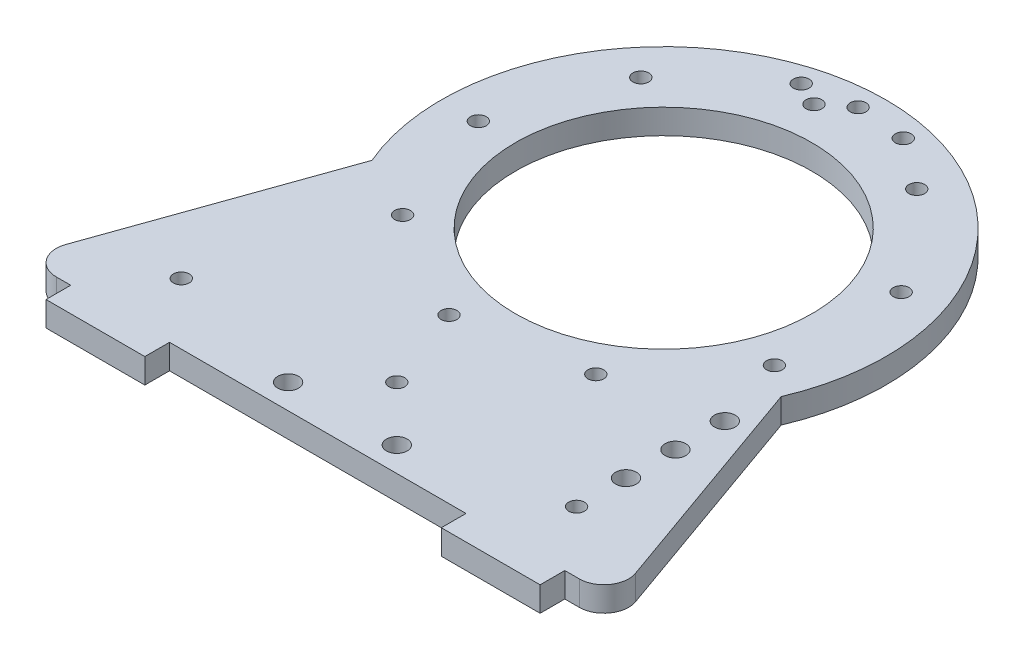
ISO-10303-21;
HEADER;
FILE_DESCRIPTION(('STEP AP214'),'2;1');
FILE_NAME('part.step','',(''),(''),'','','');
FILE_SCHEMA(('AUTOMOTIVE_DESIGN { 1 0 10303 214 1 1 1 1 }'));
ENDSEC;
DATA;
#1=APPLICATION_CONTEXT('core data for automotive mechanical design processes');
#2=APPLICATION_PROTOCOL_DEFINITION('international standard','automotive_design',2000,#1);
#3=PRODUCT_CONTEXT('',#1,'mechanical');
#4=PRODUCT('Part','Part','',(#3));
#5=PRODUCT_RELATED_PRODUCT_CATEGORY('part','',(#4));
#6=PRODUCT_DEFINITION_FORMATION('','',#4);
#7=PRODUCT_DEFINITION_CONTEXT('part definition',#1,'design');
#8=PRODUCT_DEFINITION('design','',#6,#7);
#9=PRODUCT_DEFINITION_SHAPE('','',#8);
#10=(LENGTH_UNIT() NAMED_UNIT(*) SI_UNIT(.MILLI.,.METRE.));
#11=(NAMED_UNIT(*) PLANE_ANGLE_UNIT() SI_UNIT($,.RADIAN.));
#12=(NAMED_UNIT(*) SI_UNIT($,.STERADIAN.) SOLID_ANGLE_UNIT());
#13=UNCERTAINTY_MEASURE_WITH_UNIT(LENGTH_MEASURE(1.E-05),#10,'distance_accuracy_value','');
#14=(GEOMETRIC_REPRESENTATION_CONTEXT(3) GLOBAL_UNCERTAINTY_ASSIGNED_CONTEXT((#13)) GLOBAL_UNIT_ASSIGNED_CONTEXT((#10,
#11,#12)) REPRESENTATION_CONTEXT('',''));
#15=CARTESIAN_POINT('',(0.,0.,0.));
#16=DIRECTION('',(0.,0.,1.));
#17=DIRECTION('',(1.,0.,0.));
#18=AXIS2_PLACEMENT_3D('',#15,#16,#17);
#19=CARTESIAN_POINT('',(0.,2.5,0.));
#20=DIRECTION('',(0.,1.,0.));
#21=DIRECTION('',(0.,0.,1.));
#22=AXIS2_PLACEMENT_3D('',#19,#20,#21);
#23=PLANE('',#22);
#24=CARTESIAN_POINT('',(-1.51180666250989,2.5,-40.8627442390964));
#25=DIRECTION('',(0.,1.,0.));
#26=DIRECTION('',(0.,0.,1.));
#27=AXIS2_PLACEMENT_3D('',#24,#25,#26);
#28=CIRCLE('',#27,1.59999999999999);
#29=CARTESIAN_POINT('',(-1.51180666250989,2.5,-39.2627442390964));
#30=VERTEX_POINT('',#29);
#31=EDGE_CURVE('E265',#30,#30,#28,.T.);
#32=ORIENTED_EDGE('',*,*,#31,.F.);
#33=EDGE_LOOP('',(#32));
#34=FACE_BOUND('',#33,.T.);
#35=CARTESIAN_POINT('',(0.,2.5,54.));
#36=DIRECTION('',(0.,1.,0.));
#37=DIRECTION('',(0.,0.,1.));
#38=AXIS2_PLACEMENT_3D('',#35,#36,#37);
#39=CIRCLE('',#38,1.6);
#40=CARTESIAN_POINT('',(0.,2.5,55.6));
#41=VERTEX_POINT('',#40);
#42=EDGE_CURVE('E281',#41,#41,#39,.T.);
#43=ORIENTED_EDGE('',*,*,#42,.F.);
#44=EDGE_LOOP('',(#43));
#45=FACE_BOUND('',#44,.T.);
#46=CARTESIAN_POINT('',(-6.51180666250987,2.5,36.9302907379578));
#47=DIRECTION('',(0.,1.,0.));
#48=DIRECTION('',(0.,0.,1.));
#49=AXIS2_PLACEMENT_3D('',#46,#47,#48);
#50=CIRCLE('',#49,1.6);
#51=CARTESIAN_POINT('',(-6.51180666250987,2.5,38.5302907379578));
#52=VERTEX_POINT('',#51);
#53=EDGE_CURVE('E297',#52,#52,#50,.T.);
#54=ORIENTED_EDGE('',*,*,#53,.F.);
#55=EDGE_LOOP('',(#54));
#56=FACE_BOUND('',#55,.T.);
#57=CARTESIAN_POINT('',(18.75,2.5,32.4759526419164));
#58=DIRECTION('',(0.,1.,0.));
#59=DIRECTION('',(0.,0.,1.));
#60=AXIS2_PLACEMENT_3D('',#57,#58,#59);
#61=CIRCLE('',#60,1.6);
#62=CARTESIAN_POINT('',(18.75,2.5,34.0759526419164));
#63=VERTEX_POINT('',#62);
#64=EDGE_CURVE('E313',#63,#63,#61,.T.);
#65=ORIENTED_EDGE('',*,*,#64,.F.);
#66=EDGE_LOOP('',(#65));
#67=FACE_BOUND('',#66,.T.);
#68=CARTESIAN_POINT('',(-11.,2.5,65.));
#69=DIRECTION('',(0.,1.,0.));
#70=DIRECTION('',(0.,0.,1.));
#71=AXIS2_PLACEMENT_3D('',#68,#69,#70);
#72=CIRCLE('',#71,2.1);
#73=CARTESIAN_POINT('',(-11.,2.5,67.1));
#74=VERTEX_POINT('',#73);
#75=EDGE_CURVE('E329',#74,#74,#72,.T.);
#76=ORIENTED_EDGE('',*,*,#75,.F.);
#77=EDGE_LOOP('',(#76));
#78=FACE_BOUND('',#77,.T.);
#79=CARTESIAN_POINT('',(40.,2.5,47.62));
#80=DIRECTION('',(0.,1.,0.));
#81=DIRECTION('',(0.,0.,1.));
#82=AXIS2_PLACEMENT_3D('',#79,#80,#81);
#83=CIRCLE('',#82,2.1);
#84=CARTESIAN_POINT('',(40.,2.5,49.72));
#85=VERTEX_POINT('',#84);
#86=EDGE_CURVE('E345',#85,#85,#83,.T.);
#87=ORIENTED_EDGE('',*,*,#86,.F.);
#88=EDGE_LOOP('',(#87));
#89=FACE_BOUND('',#88,.T.);
#90=CARTESIAN_POINT('',(35.2384732794716,2.5,-12.8257553747126));
#91=DIRECTION('',(0.,1.,0.));
#92=DIRECTION('',(0.,0.,1.));
#93=AXIS2_PLACEMENT_3D('',#90,#91,#92);
#94=CIRCLE('',#93,1.6);
#95=CARTESIAN_POINT('',(35.2384732794716,2.5,-11.2257553747126));
#96=VERTEX_POINT('',#95);
#97=EDGE_CURVE('E361',#96,#96,#94,.T.);
#98=ORIENTED_EDGE('',*,*,#97,.F.);
#99=EDGE_LOOP('',(#98));
#100=FACE_BOUND('',#99,.T.);
#101=CARTESIAN_POINT('',(-6.51180666250989,2.5,-36.9302907379578));
#102=DIRECTION('',(0.,1.,0.));
#103=DIRECTION('',(0.,0.,1.));
#104=AXIS2_PLACEMENT_3D('',#101,#102,#103);
#105=CIRCLE('',#104,1.6);
#106=CARTESIAN_POINT('',(-6.51180666250989,2.5,-35.3302907379578));
#107=VERTEX_POINT('',#106);
#108=EDGE_CURVE('E377',#107,#107,#105,.T.);
#109=ORIENTED_EDGE('',*,*,#108,.F.);
#110=EDGE_LOOP('',(#109));
#111=FACE_BOUND('',#110,.T.);
#112=CARTESIAN_POINT('',(11.,2.5,65.));
#113=DIRECTION('',(0.,1.,0.));
#114=DIRECTION('',(0.,0.,-1.));
#115=AXIS2_PLACEMENT_3D('',#112,#113,#114);
#116=CIRCLE('',#115,2.1);
#117=CARTESIAN_POINT('',(11.,2.5,62.9));
#118=VERTEX_POINT('',#117);
#119=EDGE_CURVE('E393',#118,#118,#116,.T.);
#120=ORIENTED_EDGE('',*,*,#119,.F.);
#121=EDGE_LOOP('',(#120));
#122=FACE_BOUND('',#121,.T.);
#123=CARTESIAN_POINT('',(-40.,2.5,57.62));
#124=DIRECTION('',(0.,1.,0.));
#125=DIRECTION('',(0.,0.,1.));
#126=AXIS2_PLACEMENT_3D('',#123,#124,#125);
#127=CIRCLE('',#126,1.6);
#128=CARTESIAN_POINT('',(-40.,2.5,59.22));
#129=VERTEX_POINT('',#128);
#130=EDGE_CURVE('E409',#129,#129,#127,.T.);
#131=ORIENTED_EDGE('',*,*,#130,.F.);
#132=EDGE_LOOP('',(#131));
#133=FACE_BOUND('',#132,.T.);
#134=CARTESIAN_POINT('',(-37.5,2.5,0.));
#135=DIRECTION('',(0.,1.,0.));
#136=DIRECTION('',(0.,0.,1.));
#137=AXIS2_PLACEMENT_3D('',#134,#135,#136);
#138=CIRCLE('',#137,1.6);
#139=CARTESIAN_POINT('',(-37.5,2.5,1.6));
#140=VERTEX_POINT('',#139);
#141=EDGE_CURVE('E417',#140,#140,#138,.T.);
#142=ORIENTED_EDGE('',*,*,#141,.F.);
#143=EDGE_LOOP('',(#142));
#144=FACE_BOUND('',#143,.T.);
#145=CARTESIAN_POINT('',(40.,2.5,57.62));
#146=DIRECTION('',(0.,1.,0.));
#147=DIRECTION('',(0.,0.,1.));
#148=AXIS2_PLACEMENT_3D('',#145,#146,#147);
#149=CIRCLE('',#148,1.6);
#150=CARTESIAN_POINT('',(40.,2.5,59.22));
#151=VERTEX_POINT('',#150);
#152=EDGE_CURVE('E401',#151,#151,#149,.T.);
#153=ORIENTED_EDGE('',*,*,#152,.F.);
#154=EDGE_LOOP('',(#153));
#155=FACE_BOUND('',#154,.T.);
#156=CARTESIAN_POINT('',(-28.7266666169617,2.5,-24.1045353632452));
#157=DIRECTION('',(0.,1.,0.));
#158=DIRECTION('',(0.,0.,1.));
#159=AXIS2_PLACEMENT_3D('',#156,#157,#158);
#160=CIRCLE('',#159,1.6);
#161=CARTESIAN_POINT('',(-28.7266666169617,2.5,-22.5045353632452));
#162=VERTEX_POINT('',#161);
#163=EDGE_CURVE('E385',#162,#162,#160,.T.);
#164=ORIENTED_EDGE('',*,*,#163,.F.);
#165=EDGE_LOOP('',(#164));
#166=FACE_BOUND('',#165,.T.);
#167=CARTESIAN_POINT('',(18.75,2.5,-32.4759526419165));
#168=DIRECTION('',(0.,1.,0.));
#169=DIRECTION('',(0.,0.,1.));
#170=AXIS2_PLACEMENT_3D('',#167,#168,#169);
#171=CIRCLE('',#170,1.6);
#172=CARTESIAN_POINT('',(18.75,2.5,-30.8759526419165));
#173=VERTEX_POINT('',#172);
#174=EDGE_CURVE('E369',#173,#173,#171,.T.);
#175=ORIENTED_EDGE('',*,*,#174,.F.);
#176=EDGE_LOOP('',(#175));
#177=FACE_BOUND('',#176,.T.);
#178=CARTESIAN_POINT('',(35.2384732794716,2.5,12.8257553747126));
#179=DIRECTION('',(0.,1.,0.));
#180=DIRECTION('',(0.,0.,1.));
#181=AXIS2_PLACEMENT_3D('',#178,#179,#180);
#182=CIRCLE('',#181,1.6);
#183=CARTESIAN_POINT('',(35.2384732794716,2.5,14.4257553747126));
#184=VERTEX_POINT('',#183);
#185=EDGE_CURVE('E353',#184,#184,#182,.T.);
#186=ORIENTED_EDGE('',*,*,#185,.F.);
#187=EDGE_LOOP('',(#186));
#188=FACE_BOUND('',#187,.T.);
#189=CARTESIAN_POINT('',(0.,2.5,0.));
#190=DIRECTION('',(0.,1.,0.));
#191=DIRECTION('',(0.,0.,1.));
#192=AXIS2_PLACEMENT_3D('',#189,#190,#191);
#193=CIRCLE('',#192,30.);
#194=CARTESIAN_POINT('',(0.,2.5,30.));
#195=VERTEX_POINT('',#194);
#196=EDGE_CURVE('E337',#195,#195,#193,.T.);
#197=ORIENTED_EDGE('',*,*,#196,.F.);
#198=EDGE_LOOP('',(#197));
#199=FACE_BOUND('',#198,.T.);
#200=CARTESIAN_POINT('',(40.,2.5,37.62));
#201=DIRECTION('',(0.,1.,0.));
#202=DIRECTION('',(0.,0.,1.));
#203=AXIS2_PLACEMENT_3D('',#200,#201,#202);
#204=CIRCLE('',#203,2.1);
#205=CARTESIAN_POINT('',(40.,2.5,39.72));
#206=VERTEX_POINT('',#205);
#207=EDGE_CURVE('E321',#206,#206,#204,.T.);
#208=ORIENTED_EDGE('',*,*,#207,.F.);
#209=EDGE_LOOP('',(#208));
#210=FACE_BOUND('',#209,.T.);
#211=CARTESIAN_POINT('',(39.9999999999999,2.5,27.62));
#212=DIRECTION('',(0.,1.,0.));
#213=DIRECTION('',(0.,0.,1.));
#214=AXIS2_PLACEMENT_3D('',#211,#212,#213);
#215=CIRCLE('',#214,2.1);
#216=CARTESIAN_POINT('',(39.9999999999999,2.5,29.72));
#217=VERTEX_POINT('',#216);
#218=EDGE_CURVE('E305',#217,#217,#215,.T.);
#219=ORIENTED_EDGE('',*,*,#218,.F.);
#220=EDGE_LOOP('',(#219));
#221=FACE_BOUND('',#220,.T.);
#222=CARTESIAN_POINT('',(-28.7266666169617,2.5,24.1045353632452));
#223=DIRECTION('',(0.,1.,0.));
#224=DIRECTION('',(0.,0.,1.));
#225=AXIS2_PLACEMENT_3D('',#222,#223,#224);
#226=CIRCLE('',#225,1.6);
#227=CARTESIAN_POINT('',(-28.7266666169617,2.5,25.7045353632452));
#228=VERTEX_POINT('',#227);
#229=EDGE_CURVE('E289',#228,#228,#226,.T.);
#230=ORIENTED_EDGE('',*,*,#229,.F.);
#231=EDGE_LOOP('',(#230));
#232=FACE_BOUND('',#231,.T.);
#233=CARTESIAN_POINT('',(8.4881933374901,2.5,-40.));
#234=DIRECTION('',(0.,1.,0.));
#235=DIRECTION('',(0.,0.,1.));
#236=AXIS2_PLACEMENT_3D('',#233,#234,#235);
#237=CIRCLE('',#236,1.6);
#238=CARTESIAN_POINT('',(8.4881933374901,2.5,-38.4));
#239=VERTEX_POINT('',#238);
#240=EDGE_CURVE('E273',#239,#239,#237,.T.);
#241=ORIENTED_EDGE('',*,*,#240,.F.);
#242=EDGE_LOOP('',(#241));
#243=FACE_BOUND('',#242,.T.);
#244=CARTESIAN_POINT('',(-11.4207172824179,2.5,-39.2634262754754));
#245=DIRECTION('',(0.,1.,0.));
#246=DIRECTION('',(0.,0.,1.));
#247=AXIS2_PLACEMENT_3D('',#244,#245,#246);
#248=CIRCLE('',#247,1.6);
#249=CARTESIAN_POINT('',(-11.4207172824179,2.5,-37.6634262754754));
#250=VERTEX_POINT('',#249);
#251=EDGE_CURVE('E257',#250,#250,#248,.T.);
#252=ORIENTED_EDGE('',*,*,#251,.F.);
#253=EDGE_LOOP('',(#252));
#254=FACE_BOUND('',#253,.T.);
#255=DIRECTION('',(-0.334515263891296,0.,0.942390332199846));
#256=VECTOR('',#255,1.);
#257=CARTESIAN_POINT('',(-31.2188957469136,2.5,-11.0816047155278));
#258=LINE('',#257,#256);
#259=CARTESIAN_POINT('',(-41.4069511072718,2.5,17.62));
#260=VERTEX_POINT('',#259);
#261=CARTESIAN_POINT('',(-57.6314712151944,2.5,63.3274236805435));
#262=VERTEX_POINT('',#261);
#263=EDGE_CURVE('E167',#260,#262,#258,.T.);
#264=ORIENTED_EDGE('',*,*,#263,.T.);
#265=CARTESIAN_POINT('',(-52.9195195541952,2.5,65.));
#266=DIRECTION('',(0.,1.,0.));
#267=DIRECTION('',(0.,0.,1.));
#268=AXIS2_PLACEMENT_3D('',#265,#266,#267);
#269=CIRCLE('',#268,5.);
#270=CARTESIAN_POINT('',(-52.9195195541952,2.5,70.));
#271=VERTEX_POINT('',#270);
#272=EDGE_CURVE('E449',#262,#271,#269,.T.);
#273=ORIENTED_EDGE('',*,*,#272,.T.);
#274=DIRECTION('',(1.,0.,0.));
#275=VECTOR('',#274,1.);
#276=CARTESIAN_POINT('',(-60.,2.5,70.));
#277=LINE('',#276,#275);
#278=CARTESIAN_POINT('',(-50.,2.5,70.));
#279=VERTEX_POINT('',#278);
#280=EDGE_CURVE('E425',#271,#279,#277,.T.);
#281=ORIENTED_EDGE('',*,*,#280,.T.);
#282=DIRECTION('',(0.,0.,-1.));
#283=VECTOR('',#282,1.);
#284=CARTESIAN_POINT('',(-50.,2.5,75.));
#285=LINE('',#284,#283);
#286=CARTESIAN_POINT('',(-50.,2.5,75.));
#287=VERTEX_POINT('',#286);
#288=EDGE_CURVE('E234',#287,#279,#285,.T.);
#289=ORIENTED_EDGE('',*,*,#288,.F.);
#290=DIRECTION('',(-1.,0.,0.));
#291=VECTOR('',#290,1.);
#292=CARTESIAN_POINT('',(-50.,2.5,75.));
#293=LINE('',#292,#291);
#294=CARTESIAN_POINT('',(-30.,2.5,75.));
#295=VERTEX_POINT('',#294);
#296=EDGE_CURVE('E231',#295,#287,#293,.T.);
#297=ORIENTED_EDGE('',*,*,#296,.F.);
#298=DIRECTION('',(0.,0.,-1.));
#299=VECTOR('',#298,1.);
#300=CARTESIAN_POINT('',(-30.,2.5,75.));
#301=LINE('',#300,#299);
#302=CARTESIAN_POINT('',(-30.,2.5,70.));
#303=VERTEX_POINT('',#302);
#304=EDGE_CURVE('E244',#295,#303,#301,.T.);
#305=ORIENTED_EDGE('',*,*,#304,.T.);
#306=CARTESIAN_POINT('',(30.,2.5,70.));
#307=VERTEX_POINT('',#306);
#308=EDGE_CURVE('E429',#303,#307,#277,.T.);
#309=ORIENTED_EDGE('',*,*,#308,.T.);
#310=DIRECTION('',(0.,0.,-1.));
#311=VECTOR('',#310,1.);
#312=CARTESIAN_POINT('',(30.,2.5,75.));
#313=LINE('',#312,#311);
#314=CARTESIAN_POINT('',(30.,2.5,75.));
#315=VERTEX_POINT('',#314);
#316=EDGE_CURVE('E211',#315,#307,#313,.T.);
#317=ORIENTED_EDGE('',*,*,#316,.F.);
#318=DIRECTION('',(-1.,0.,0.));
#319=VECTOR('',#318,1.);
#320=CARTESIAN_POINT('',(50.,2.5,75.));
#321=LINE('',#320,#319);
#322=CARTESIAN_POINT('',(50.,2.5,75.));
#323=VERTEX_POINT('',#322);
#324=EDGE_CURVE('E187',#323,#315,#321,.T.);
#325=ORIENTED_EDGE('',*,*,#324,.F.);
#326=DIRECTION('',(0.,0.,-1.));
#327=VECTOR('',#326,1.);
#328=CARTESIAN_POINT('',(50.,2.5,75.));
#329=LINE('',#328,#327);
#330=CARTESIAN_POINT('',(49.9999999999999,2.5,70.));
#331=VERTEX_POINT('',#330);
#332=EDGE_CURVE('E215',#323,#331,#329,.T.);
#333=ORIENTED_EDGE('',*,*,#332,.T.);
#334=CARTESIAN_POINT('',(52.9195195541952,2.5,70.));
#335=VERTEX_POINT('',#334);
#336=EDGE_CURVE('E430',#331,#335,#277,.T.);
#337=ORIENTED_EDGE('',*,*,#336,.T.);
#338=CARTESIAN_POINT('',(52.9195195541952,2.5,65.));
#339=DIRECTION('',(0.,1.,0.));
#340=DIRECTION('',(0.,0.,1.));
#341=AXIS2_PLACEMENT_3D('',#338,#339,#340);
#342=CIRCLE('',#341,5.);
#343=CARTESIAN_POINT('',(57.6314712151944,2.5,63.3274236805435));
#344=VERTEX_POINT('',#343);
#345=EDGE_CURVE('E55',#335,#344,#342,.T.);
#346=ORIENTED_EDGE('',*,*,#345,.T.);
#347=DIRECTION('',(0.334515263891296,0.,0.942390332199846));
#348=VECTOR('',#347,1.);
#349=CARTESIAN_POINT('',(31.2188957469136,2.5,-11.0816047155278));
#350=LINE('',#349,#348);
#351=CARTESIAN_POINT('',(41.4069511072718,2.5,17.62));
#352=VERTEX_POINT('',#351);
#353=EDGE_CURVE('E171',#352,#344,#350,.T.);
#354=ORIENTED_EDGE('',*,*,#353,.F.);
#355=CARTESIAN_POINT('',(0.,2.5,0.));
#356=DIRECTION('',(0.,1.,0.));
#357=DIRECTION('',(0.,0.,1.));
#358=AXIS2_PLACEMENT_3D('',#355,#356,#357);
#359=CIRCLE('',#358,45.);
#360=EDGE_CURVE('E148',#352,#260,#359,.T.);
#361=ORIENTED_EDGE('',*,*,#360,.T.);
#362=EDGE_LOOP('',(#264,#273,#281,#289,#297,#305,#309,#317,#325,#333,#337,#346,#354,#361));
#363=FACE_BOUND('',#362,.T.);
#364=ADVANCED_FACE('F39',(#34,#45,#56,#67,#78,#89,#100,#111,#122,#133,#144,#155,#166,#177,#188,
#199,#210,#221,#232,#243,#254,#363),#23,.T.);
#365=CARTESIAN_POINT('',(0.,-2.5,0.));
#366=DIRECTION('',(0.,1.,0.));
#367=DIRECTION('',(0.,0.,1.));
#368=AXIS2_PLACEMENT_3D('',#365,#366,#367);
#369=PLANE('',#368);
#370=CARTESIAN_POINT('',(-11.4207172824179,-2.5,-39.2634262754754));
#371=DIRECTION('',(0.,1.,0.));
#372=DIRECTION('',(0.,0.,1.));
#373=AXIS2_PLACEMENT_3D('',#370,#371,#372);
#374=CIRCLE('',#373,1.6);
#375=CARTESIAN_POINT('',(-11.4207172824179,-2.5,-37.6634262754754));
#376=VERTEX_POINT('',#375);
#377=EDGE_CURVE('E256',#376,#376,#374,.T.);
#378=ORIENTED_EDGE('',*,*,#377,.T.);
#379=EDGE_LOOP('',(#378));
#380=FACE_BOUND('',#379,.T.);
#381=CARTESIAN_POINT('',(-1.51180666250989,-2.5,-40.8627442390964));
#382=DIRECTION('',(0.,1.,0.));
#383=DIRECTION('',(0.,0.,1.));
#384=AXIS2_PLACEMENT_3D('',#381,#382,#383);
#385=CIRCLE('',#384,1.59999999999999);
#386=CARTESIAN_POINT('',(-1.51180666250989,-2.5,-39.2627442390964));
#387=VERTEX_POINT('',#386);
#388=EDGE_CURVE('E261',#387,#387,#385,.T.);
#389=ORIENTED_EDGE('',*,*,#388,.T.);
#390=EDGE_LOOP('',(#389));
#391=FACE_BOUND('',#390,.T.);
#392=CARTESIAN_POINT('',(8.4881933374901,-2.5,-40.));
#393=DIRECTION('',(0.,1.,0.));
#394=DIRECTION('',(0.,0.,1.));
#395=AXIS2_PLACEMENT_3D('',#392,#393,#394);
#396=CIRCLE('',#395,1.6);
#397=CARTESIAN_POINT('',(8.4881933374901,-2.5,-38.4));
#398=VERTEX_POINT('',#397);
#399=EDGE_CURVE('E269',#398,#398,#396,.T.);
#400=ORIENTED_EDGE('',*,*,#399,.T.);
#401=EDGE_LOOP('',(#400));
#402=FACE_BOUND('',#401,.T.);
#403=CARTESIAN_POINT('',(0.,-2.5,54.));
#404=DIRECTION('',(0.,1.,0.));
#405=DIRECTION('',(0.,0.,1.));
#406=AXIS2_PLACEMENT_3D('',#403,#404,#405);
#407=CIRCLE('',#406,1.6);
#408=CARTESIAN_POINT('',(0.,-2.5,55.6));
#409=VERTEX_POINT('',#408);
#410=EDGE_CURVE('E277',#409,#409,#407,.T.);
#411=ORIENTED_EDGE('',*,*,#410,.T.);
#412=EDGE_LOOP('',(#411));
#413=FACE_BOUND('',#412,.T.);
#414=CARTESIAN_POINT('',(-28.7266666169617,-2.5,24.1045353632452));
#415=DIRECTION('',(0.,1.,0.));
#416=DIRECTION('',(0.,0.,1.));
#417=AXIS2_PLACEMENT_3D('',#414,#415,#416);
#418=CIRCLE('',#417,1.6);
#419=CARTESIAN_POINT('',(-28.7266666169617,-2.5,25.7045353632452));
#420=VERTEX_POINT('',#419);
#421=EDGE_CURVE('E285',#420,#420,#418,.T.);
#422=ORIENTED_EDGE('',*,*,#421,.T.);
#423=EDGE_LOOP('',(#422));
#424=FACE_BOUND('',#423,.T.);
#425=CARTESIAN_POINT('',(-6.51180666250987,-2.5,36.9302907379578));
#426=DIRECTION('',(0.,1.,0.));
#427=DIRECTION('',(0.,0.,1.));
#428=AXIS2_PLACEMENT_3D('',#425,#426,#427);
#429=CIRCLE('',#428,1.6);
#430=CARTESIAN_POINT('',(-6.51180666250987,-2.5,38.5302907379578));
#431=VERTEX_POINT('',#430);
#432=EDGE_CURVE('E293',#431,#431,#429,.T.);
#433=ORIENTED_EDGE('',*,*,#432,.T.);
#434=EDGE_LOOP('',(#433));
#435=FACE_BOUND('',#434,.T.);
#436=CARTESIAN_POINT('',(39.9999999999999,-2.5,27.62));
#437=DIRECTION('',(0.,1.,0.));
#438=DIRECTION('',(0.,0.,1.));
#439=AXIS2_PLACEMENT_3D('',#436,#437,#438);
#440=CIRCLE('',#439,2.1);
#441=CARTESIAN_POINT('',(39.9999999999999,-2.5,29.72));
#442=VERTEX_POINT('',#441);
#443=EDGE_CURVE('E301',#442,#442,#440,.T.);
#444=ORIENTED_EDGE('',*,*,#443,.T.);
#445=EDGE_LOOP('',(#444));
#446=FACE_BOUND('',#445,.T.);
#447=CARTESIAN_POINT('',(18.75,-2.5,32.4759526419164));
#448=DIRECTION('',(0.,1.,0.));
#449=DIRECTION('',(0.,0.,1.));
#450=AXIS2_PLACEMENT_3D('',#447,#448,#449);
#451=CIRCLE('',#450,1.6);
#452=CARTESIAN_POINT('',(18.75,-2.5,34.0759526419164));
#453=VERTEX_POINT('',#452);
#454=EDGE_CURVE('E309',#453,#453,#451,.T.);
#455=ORIENTED_EDGE('',*,*,#454,.T.);
#456=EDGE_LOOP('',(#455));
#457=FACE_BOUND('',#456,.T.);
#458=CARTESIAN_POINT('',(40.,-2.5,37.62));
#459=DIRECTION('',(0.,1.,0.));
#460=DIRECTION('',(0.,0.,1.));
#461=AXIS2_PLACEMENT_3D('',#458,#459,#460);
#462=CIRCLE('',#461,2.1);
#463=CARTESIAN_POINT('',(40.,-2.5,39.72));
#464=VERTEX_POINT('',#463);
#465=EDGE_CURVE('E317',#464,#464,#462,.T.);
#466=ORIENTED_EDGE('',*,*,#465,.T.);
#467=EDGE_LOOP('',(#466));
#468=FACE_BOUND('',#467,.T.);
#469=CARTESIAN_POINT('',(-11.,-2.5,65.));
#470=DIRECTION('',(0.,1.,0.));
#471=DIRECTION('',(0.,0.,1.));
#472=AXIS2_PLACEMENT_3D('',#469,#470,#471);
#473=CIRCLE('',#472,2.1);
#474=CARTESIAN_POINT('',(-11.,-2.5,67.1));
#475=VERTEX_POINT('',#474);
#476=EDGE_CURVE('E325',#475,#475,#473,.T.);
#477=ORIENTED_EDGE('',*,*,#476,.T.);
#478=EDGE_LOOP('',(#477));
#479=FACE_BOUND('',#478,.T.);
#480=CARTESIAN_POINT('',(0.,-2.5,0.));
#481=DIRECTION('',(0.,1.,0.));
#482=DIRECTION('',(0.,0.,1.));
#483=AXIS2_PLACEMENT_3D('',#480,#481,#482);
#484=CIRCLE('',#483,30.);
#485=CARTESIAN_POINT('',(0.,-2.5,30.));
#486=VERTEX_POINT('',#485);
#487=EDGE_CURVE('E333',#486,#486,#484,.T.);
#488=ORIENTED_EDGE('',*,*,#487,.T.);
#489=EDGE_LOOP('',(#488));
#490=FACE_BOUND('',#489,.T.);
#491=CARTESIAN_POINT('',(40.,-2.5,47.62));
#492=DIRECTION('',(0.,1.,0.));
#493=DIRECTION('',(0.,0.,1.));
#494=AXIS2_PLACEMENT_3D('',#491,#492,#493);
#495=CIRCLE('',#494,2.1);
#496=CARTESIAN_POINT('',(40.,-2.5,49.72));
#497=VERTEX_POINT('',#496);
#498=EDGE_CURVE('E341',#497,#497,#495,.T.);
#499=ORIENTED_EDGE('',*,*,#498,.T.);
#500=EDGE_LOOP('',(#499));
#501=FACE_BOUND('',#500,.T.);
#502=CARTESIAN_POINT('',(35.2384732794716,-2.5,12.8257553747126));
#503=DIRECTION('',(0.,1.,0.));
#504=DIRECTION('',(0.,0.,1.));
#505=AXIS2_PLACEMENT_3D('',#502,#503,#504);
#506=CIRCLE('',#505,1.6);
#507=CARTESIAN_POINT('',(35.2384732794716,-2.5,14.4257553747126));
#508=VERTEX_POINT('',#507);
#509=EDGE_CURVE('E349',#508,#508,#506,.T.);
#510=ORIENTED_EDGE('',*,*,#509,.T.);
#511=EDGE_LOOP('',(#510));
#512=FACE_BOUND('',#511,.T.);
#513=CARTESIAN_POINT('',(35.2384732794716,-2.5,-12.8257553747126));
#514=DIRECTION('',(0.,1.,0.));
#515=DIRECTION('',(0.,0.,1.));
#516=AXIS2_PLACEMENT_3D('',#513,#514,#515);
#517=CIRCLE('',#516,1.6);
#518=CARTESIAN_POINT('',(35.2384732794716,-2.5,-11.2257553747126));
#519=VERTEX_POINT('',#518);
#520=EDGE_CURVE('E357',#519,#519,#517,.T.);
#521=ORIENTED_EDGE('',*,*,#520,.T.);
#522=EDGE_LOOP('',(#521));
#523=FACE_BOUND('',#522,.T.);
#524=CARTESIAN_POINT('',(18.75,-2.5,-32.4759526419165));
#525=DIRECTION('',(0.,1.,0.));
#526=DIRECTION('',(0.,0.,1.));
#527=AXIS2_PLACEMENT_3D('',#524,#525,#526);
#528=CIRCLE('',#527,1.6);
#529=CARTESIAN_POINT('',(18.75,-2.5,-30.8759526419165));
#530=VERTEX_POINT('',#529);
#531=EDGE_CURVE('E365',#530,#530,#528,.T.);
#532=ORIENTED_EDGE('',*,*,#531,.T.);
#533=EDGE_LOOP('',(#532));
#534=FACE_BOUND('',#533,.T.);
#535=CARTESIAN_POINT('',(-6.51180666250989,-2.5,-36.9302907379578));
#536=DIRECTION('',(0.,1.,0.));
#537=DIRECTION('',(0.,0.,1.));
#538=AXIS2_PLACEMENT_3D('',#535,#536,#537);
#539=CIRCLE('',#538,1.6);
#540=CARTESIAN_POINT('',(-6.51180666250989,-2.5,-35.3302907379578));
#541=VERTEX_POINT('',#540);
#542=EDGE_CURVE('E373',#541,#541,#539,.T.);
#543=ORIENTED_EDGE('',*,*,#542,.T.);
#544=EDGE_LOOP('',(#543));
#545=FACE_BOUND('',#544,.T.);
#546=CARTESIAN_POINT('',(-28.7266666169617,-2.5,-24.1045353632452));
#547=DIRECTION('',(0.,1.,0.));
#548=DIRECTION('',(0.,0.,1.));
#549=AXIS2_PLACEMENT_3D('',#546,#547,#548);
#550=CIRCLE('',#549,1.6);
#551=CARTESIAN_POINT('',(-28.7266666169617,-2.5,-22.5045353632452));
#552=VERTEX_POINT('',#551);
#553=EDGE_CURVE('E381',#552,#552,#550,.T.);
#554=ORIENTED_EDGE('',*,*,#553,.T.);
#555=EDGE_LOOP('',(#554));
#556=FACE_BOUND('',#555,.T.);
#557=CARTESIAN_POINT('',(11.,-2.5,65.));
#558=DIRECTION('',(0.,1.,0.));
#559=DIRECTION('',(0.,0.,-1.));
#560=AXIS2_PLACEMENT_3D('',#557,#558,#559);
#561=CIRCLE('',#560,2.1);
#562=CARTESIAN_POINT('',(11.,-2.5,62.9));
#563=VERTEX_POINT('',#562);
#564=EDGE_CURVE('E389',#563,#563,#561,.T.);
#565=ORIENTED_EDGE('',*,*,#564,.T.);
#566=EDGE_LOOP('',(#565));
#567=FACE_BOUND('',#566,.T.);
#568=CARTESIAN_POINT('',(40.,-2.5,57.62));
#569=DIRECTION('',(0.,1.,0.));
#570=DIRECTION('',(0.,0.,1.));
#571=AXIS2_PLACEMENT_3D('',#568,#569,#570);
#572=CIRCLE('',#571,1.6);
#573=CARTESIAN_POINT('',(40.,-2.5,59.22));
#574=VERTEX_POINT('',#573);
#575=EDGE_CURVE('E397',#574,#574,#572,.T.);
#576=ORIENTED_EDGE('',*,*,#575,.T.);
#577=EDGE_LOOP('',(#576));
#578=FACE_BOUND('',#577,.T.);
#579=CARTESIAN_POINT('',(-40.,-2.5,57.62));
#580=DIRECTION('',(0.,1.,0.));
#581=DIRECTION('',(0.,0.,1.));
#582=AXIS2_PLACEMENT_3D('',#579,#580,#581);
#583=CIRCLE('',#582,1.6);
#584=CARTESIAN_POINT('',(-40.,-2.5,59.22));
#585=VERTEX_POINT('',#584);
#586=EDGE_CURVE('E405',#585,#585,#583,.T.);
#587=ORIENTED_EDGE('',*,*,#586,.T.);
#588=EDGE_LOOP('',(#587));
#589=FACE_BOUND('',#588,.T.);
#590=CARTESIAN_POINT('',(-37.5,-2.5,0.));
#591=DIRECTION('',(0.,1.,0.));
#592=DIRECTION('',(0.,0.,1.));
#593=AXIS2_PLACEMENT_3D('',#590,#591,#592);
#594=CIRCLE('',#593,1.6);
#595=CARTESIAN_POINT('',(-37.5,-2.5,1.6));
#596=VERTEX_POINT('',#595);
#597=EDGE_CURVE('E413',#596,#596,#594,.T.);
#598=ORIENTED_EDGE('',*,*,#597,.T.);
#599=EDGE_LOOP('',(#598));
#600=FACE_BOUND('',#599,.T.);
#601=DIRECTION('',(1.,0.,0.));
#602=VECTOR('',#601,1.);
#603=CARTESIAN_POINT('',(-60.,-2.5,70.));
#604=LINE('',#603,#602);
#605=CARTESIAN_POINT('',(-52.9195195541952,-2.5,70.));
#606=VERTEX_POINT('',#605);
#607=CARTESIAN_POINT('',(-50.,-2.5,70.));
#608=VERTEX_POINT('',#607);
#609=EDGE_CURVE('E431',#606,#608,#604,.T.);
#610=ORIENTED_EDGE('',*,*,#609,.F.);
#611=CARTESIAN_POINT('',(-52.9195195541952,-2.5,65.));
#612=DIRECTION('',(0.,1.,0.));
#613=DIRECTION('',(0.,0.,1.));
#614=AXIS2_PLACEMENT_3D('',#611,#612,#613);
#615=CIRCLE('',#614,5.);
#616=CARTESIAN_POINT('',(-57.6314712151944,-2.5,63.3274236805435));
#617=VERTEX_POINT('',#616);
#618=EDGE_CURVE('E441',#606,#617,#615,.F.);
#619=ORIENTED_EDGE('',*,*,#618,.T.);
#620=DIRECTION('',(-0.334515263891296,0.,0.942390332199846));
#621=VECTOR('',#620,1.);
#622=CARTESIAN_POINT('',(-31.2188957469136,-2.5,-11.0816047155278));
#623=LINE('',#622,#621);
#624=CARTESIAN_POINT('',(-41.4069511072718,-2.5,17.62));
#625=VERTEX_POINT('',#624);
#626=EDGE_CURVE('E152',#625,#617,#623,.T.);
#627=ORIENTED_EDGE('',*,*,#626,.F.);
#628=CARTESIAN_POINT('',(0.,-2.5,0.));
#629=DIRECTION('',(0.,1.,0.));
#630=DIRECTION('',(0.,0.,1.));
#631=AXIS2_PLACEMENT_3D('',#628,#629,#630);
#632=CIRCLE('',#631,45.);
#633=CARTESIAN_POINT('',(41.4069511072718,-2.5,17.62));
#634=VERTEX_POINT('',#633);
#635=EDGE_CURVE('E145',#634,#625,#632,.T.);
#636=ORIENTED_EDGE('',*,*,#635,.F.);
#637=DIRECTION('',(0.334515263891296,0.,0.942390332199846));
#638=VECTOR('',#637,1.);
#639=CARTESIAN_POINT('',(31.2188957469136,-2.5,-11.0816047155278));
#640=LINE('',#639,#638);
#641=CARTESIAN_POINT('',(57.6314712151944,-2.5,63.3274236805435));
#642=VERTEX_POINT('',#641);
#643=EDGE_CURVE('E156',#634,#642,#640,.T.);
#644=ORIENTED_EDGE('',*,*,#643,.T.);
#645=CARTESIAN_POINT('',(52.9195195541952,-2.5,65.));
#646=DIRECTION('',(0.,1.,0.));
#647=DIRECTION('',(0.,0.,1.));
#648=AXIS2_PLACEMENT_3D('',#645,#646,#647);
#649=CIRCLE('',#648,5.);
#650=CARTESIAN_POINT('',(52.9195195541952,-2.5,70.));
#651=VERTEX_POINT('',#650);
#652=EDGE_CURVE('E438',#642,#651,#649,.F.);
#653=ORIENTED_EDGE('',*,*,#652,.T.);
#654=CARTESIAN_POINT('',(50.,-2.5,70.));
#655=VERTEX_POINT('',#654);
#656=EDGE_CURVE('E421',#655,#651,#604,.T.);
#657=ORIENTED_EDGE('',*,*,#656,.F.);
#658=DIRECTION('',(0.,0.,-1.));
#659=VECTOR('',#658,1.);
#660=CARTESIAN_POINT('',(50.,-2.5,75.));
#661=LINE('',#660,#659);
#662=CARTESIAN_POINT('',(50.,-2.5,75.));
#663=VERTEX_POINT('',#662);
#664=EDGE_CURVE('E197',#663,#655,#661,.T.);
#665=ORIENTED_EDGE('',*,*,#664,.F.);
#666=DIRECTION('',(1.,0.,0.));
#667=VECTOR('',#666,1.);
#668=CARTESIAN_POINT('',(50.,-2.5,75.));
#669=LINE('',#668,#667);
#670=CARTESIAN_POINT('',(30.,-2.5,75.));
#671=VERTEX_POINT('',#670);
#672=EDGE_CURVE('E194',#671,#663,#669,.T.);
#673=ORIENTED_EDGE('',*,*,#672,.F.);
#674=DIRECTION('',(0.,0.,-1.));
#675=VECTOR('',#674,1.);
#676=CARTESIAN_POINT('',(30.,-2.5,75.));
#677=LINE('',#676,#675);
#678=CARTESIAN_POINT('',(30.,-2.5,70.));
#679=VERTEX_POINT('',#678);
#680=EDGE_CURVE('E207',#671,#679,#677,.T.);
#681=ORIENTED_EDGE('',*,*,#680,.T.);
#682=CARTESIAN_POINT('',(-30.,-2.5,70.));
#683=VERTEX_POINT('',#682);
#684=EDGE_CURVE('E434',#683,#679,#604,.T.);
#685=ORIENTED_EDGE('',*,*,#684,.F.);
#686=DIRECTION('',(0.,0.,-1.));
#687=VECTOR('',#686,1.);
#688=CARTESIAN_POINT('',(-30.,-2.5,75.));
#689=LINE('',#688,#687);
#690=CARTESIAN_POINT('',(-30.,-2.5,75.));
#691=VERTEX_POINT('',#690);
#692=EDGE_CURVE('E248',#691,#683,#689,.T.);
#693=ORIENTED_EDGE('',*,*,#692,.F.);
#694=DIRECTION('',(1.,0.,0.));
#695=VECTOR('',#694,1.);
#696=CARTESIAN_POINT('',(-50.,-2.5,75.));
#697=LINE('',#696,#695);
#698=CARTESIAN_POINT('',(-50.,-2.5,75.));
#699=VERTEX_POINT('',#698);
#700=EDGE_CURVE('E224',#699,#691,#697,.T.);
#701=ORIENTED_EDGE('',*,*,#700,.F.);
#702=DIRECTION('',(0.,0.,-1.));
#703=VECTOR('',#702,1.);
#704=CARTESIAN_POINT('',(-50.,-2.5,75.));
#705=LINE('',#704,#703);
#706=EDGE_CURVE('E252',#699,#608,#705,.T.);
#707=ORIENTED_EDGE('',*,*,#706,.T.);
#708=EDGE_LOOP('',(#610,#619,#627,#636,#644,#653,#657,#665,#673,#681,#685,#693,#701,#707));
#709=FACE_BOUND('',#708,.T.);
#710=ADVANCED_FACE('F164',(#380,#391,#402,#413,#424,#435,#446,#457,#468,#479,#490,#501,#512,
#523,#534,#545,#556,#567,#578,#589,#600,#709),#369,.F.);
#711=CARTESIAN_POINT('',(-60.,2.5,70.));
#712=DIRECTION('',(0.,0.,-1.));
#713=DIRECTION('',(-1.,0.,0.));
#714=AXIS2_PLACEMENT_3D('',#711,#712,#713);
#715=PLANE('',#714);
#716=ORIENTED_EDGE('',*,*,#656,.T.);
#717=DIRECTION('',(0.,-1.,0.));
#718=VECTOR('',#717,1.);
#719=CARTESIAN_POINT('',(52.9195195541952,2.5,70.));
#720=LINE('',#719,#718);
#721=EDGE_CURVE('E11',#651,#335,#720,.F.);
#722=ORIENTED_EDGE('',*,*,#721,.T.);
#723=ORIENTED_EDGE('',*,*,#336,.F.);
#724=DIRECTION('',(0.,1.,0.));
#725=VECTOR('',#724,1.);
#726=CARTESIAN_POINT('',(50.,2.5,70.));
#727=LINE('',#726,#725);
#728=EDGE_CURVE('E181',#655,#331,#727,.T.);
#729=ORIENTED_EDGE('',*,*,#728,.F.);
#730=EDGE_LOOP('',(#716,#722,#723,#729));
#731=FACE_BOUND('',#730,.T.);
#732=ADVANCED_FACE('F458',(#731),#715,.F.);
#733=DIRECTION('',(0.,-1.,0.));
#734=VECTOR('',#733,1.);
#735=CARTESIAN_POINT('',(30.,2.5,70.));
#736=LINE('',#735,#734);
#737=EDGE_CURVE('E188',#307,#679,#736,.T.);
#738=ORIENTED_EDGE('',*,*,#737,.F.);
#739=ORIENTED_EDGE('',*,*,#308,.F.);
#740=DIRECTION('',(0.,1.,0.));
#741=VECTOR('',#740,1.);
#742=CARTESIAN_POINT('',(-30.,2.5,70.));
#743=LINE('',#742,#741);
#744=EDGE_CURVE('E225',#683,#303,#743,.T.);
#745=ORIENTED_EDGE('',*,*,#744,.F.);
#746=ORIENTED_EDGE('',*,*,#684,.T.);
#747=EDGE_LOOP('',(#738,#739,#745,#746));
#748=FACE_BOUND('',#747,.T.);
#749=ADVANCED_FACE('F483',(#748),#715,.F.);
#750=ORIENTED_EDGE('',*,*,#280,.F.);
#751=DIRECTION('',(0.,-1.,0.));
#752=VECTOR('',#751,1.);
#753=CARTESIAN_POINT('',(-52.9195195541952,-2.5,70.));
#754=LINE('',#753,#752);
#755=EDGE_CURVE('E428',#271,#606,#754,.T.);
#756=ORIENTED_EDGE('',*,*,#755,.T.);
#757=ORIENTED_EDGE('',*,*,#609,.T.);
#758=DIRECTION('',(0.,-1.,0.));
#759=VECTOR('',#758,1.);
#760=CARTESIAN_POINT('',(-50.,2.5,70.));
#761=LINE('',#760,#759);
#762=EDGE_CURVE('E219',#279,#608,#761,.T.);
#763=ORIENTED_EDGE('',*,*,#762,.F.);
#764=EDGE_LOOP('',(#750,#756,#757,#763));
#765=FACE_BOUND('',#764,.T.);
#766=ADVANCED_FACE('F481',(#765),#715,.F.);
#767=CARTESIAN_POINT('',(-37.5,2.5,0.));
#768=DIRECTION('',(0.,-1.,0.));
#769=DIRECTION('',(0.,0.,-1.));
#770=AXIS2_PLACEMENT_3D('',#767,#768,#769);
#771=CYLINDRICAL_SURFACE('',#770,1.6);
#772=ORIENTED_EDGE('',*,*,#141,.T.);
#773=EDGE_LOOP('',(#772));
#774=FACE_BOUND('',#773,.T.);
#775=ORIENTED_EDGE('',*,*,#597,.F.);
#776=EDGE_LOOP('',(#775));
#777=FACE_BOUND('',#776,.T.);
#778=ADVANCED_FACE('F478',(#774,#777),#771,.F.);
#779=CARTESIAN_POINT('',(-40.,2.5,57.62));
#780=DIRECTION('',(0.,-1.,0.));
#781=DIRECTION('',(0.,0.,-1.));
#782=AXIS2_PLACEMENT_3D('',#779,#780,#781);
#783=CYLINDRICAL_SURFACE('',#782,1.6);
#784=ORIENTED_EDGE('',*,*,#130,.T.);
#785=EDGE_LOOP('',(#784));
#786=FACE_BOUND('',#785,.T.);
#787=ORIENTED_EDGE('',*,*,#586,.F.);
#788=EDGE_LOOP('',(#787));
#789=FACE_BOUND('',#788,.T.);
#790=ADVANCED_FACE('F489',(#786,#789),#783,.F.);
#791=CARTESIAN_POINT('',(40.,2.5,57.62));
#792=DIRECTION('',(0.,-1.,0.));
#793=DIRECTION('',(0.,0.,-1.));
#794=AXIS2_PLACEMENT_3D('',#791,#792,#793);
#795=CYLINDRICAL_SURFACE('',#794,1.6);
#796=ORIENTED_EDGE('',*,*,#152,.T.);
#797=EDGE_LOOP('',(#796));
#798=FACE_BOUND('',#797,.T.);
#799=ORIENTED_EDGE('',*,*,#575,.F.);
#800=EDGE_LOOP('',(#799));
#801=FACE_BOUND('',#800,.T.);
#802=ADVANCED_FACE('F699',(#798,#801),#795,.F.);
#803=CARTESIAN_POINT('',(11.,2.5,65.));
#804=DIRECTION('',(0.,-1.,0.));
#805=DIRECTION('',(0.,0.,-1.));
#806=AXIS2_PLACEMENT_3D('',#803,#804,#805);
#807=CYLINDRICAL_SURFACE('',#806,2.1);
#808=ORIENTED_EDGE('',*,*,#119,.T.);
#809=EDGE_LOOP('',(#808));
#810=FACE_BOUND('',#809,.T.);
#811=ORIENTED_EDGE('',*,*,#564,.F.);
#812=EDGE_LOOP('',(#811));
#813=FACE_BOUND('',#812,.T.);
#814=ADVANCED_FACE('F695',(#810,#813),#807,.F.);
#815=CARTESIAN_POINT('',(-28.7266666169617,2.5,-24.1045353632452));
#816=DIRECTION('',(0.,-1.,0.));
#817=DIRECTION('',(0.,0.,-1.));
#818=AXIS2_PLACEMENT_3D('',#815,#816,#817);
#819=CYLINDRICAL_SURFACE('',#818,1.6);
#820=ORIENTED_EDGE('',*,*,#163,.T.);
#821=EDGE_LOOP('',(#820));
#822=FACE_BOUND('',#821,.T.);
#823=ORIENTED_EDGE('',*,*,#553,.F.);
#824=EDGE_LOOP('',(#823));
#825=FACE_BOUND('',#824,.T.);
#826=ADVANCED_FACE('F691',(#822,#825),#819,.F.);
#827=CARTESIAN_POINT('',(-6.51180666250989,2.5,-36.9302907379578));
#828=DIRECTION('',(0.,-1.,0.));
#829=DIRECTION('',(0.,0.,-1.));
#830=AXIS2_PLACEMENT_3D('',#827,#828,#829);
#831=CYLINDRICAL_SURFACE('',#830,1.6);
#832=ORIENTED_EDGE('',*,*,#108,.T.);
#833=EDGE_LOOP('',(#832));
#834=FACE_BOUND('',#833,.T.);
#835=ORIENTED_EDGE('',*,*,#542,.F.);
#836=EDGE_LOOP('',(#835));
#837=FACE_BOUND('',#836,.T.);
#838=ADVANCED_FACE('F687',(#834,#837),#831,.F.);
#839=CARTESIAN_POINT('',(18.75,2.5,-32.4759526419165));
#840=DIRECTION('',(0.,-1.,0.));
#841=DIRECTION('',(0.,0.,-1.));
#842=AXIS2_PLACEMENT_3D('',#839,#840,#841);
#843=CYLINDRICAL_SURFACE('',#842,1.6);
#844=ORIENTED_EDGE('',*,*,#174,.T.);
#845=EDGE_LOOP('',(#844));
#846=FACE_BOUND('',#845,.T.);
#847=ORIENTED_EDGE('',*,*,#531,.F.);
#848=EDGE_LOOP('',(#847));
#849=FACE_BOUND('',#848,.T.);
#850=ADVANCED_FACE('F683',(#846,#849),#843,.F.);
#851=CARTESIAN_POINT('',(35.2384732794716,2.5,-12.8257553747126));
#852=DIRECTION('',(0.,-1.,0.));
#853=DIRECTION('',(0.,0.,-1.));
#854=AXIS2_PLACEMENT_3D('',#851,#852,#853);
#855=CYLINDRICAL_SURFACE('',#854,1.6);
#856=ORIENTED_EDGE('',*,*,#97,.T.);
#857=EDGE_LOOP('',(#856));
#858=FACE_BOUND('',#857,.T.);
#859=ORIENTED_EDGE('',*,*,#520,.F.);
#860=EDGE_LOOP('',(#859));
#861=FACE_BOUND('',#860,.T.);
#862=ADVANCED_FACE('F679',(#858,#861),#855,.F.);
#863=CARTESIAN_POINT('',(35.2384732794716,2.5,12.8257553747126));
#864=DIRECTION('',(0.,-1.,0.));
#865=DIRECTION('',(0.,0.,-1.));
#866=AXIS2_PLACEMENT_3D('',#863,#864,#865);
#867=CYLINDRICAL_SURFACE('',#866,1.6);
#868=ORIENTED_EDGE('',*,*,#185,.T.);
#869=EDGE_LOOP('',(#868));
#870=FACE_BOUND('',#869,.T.);
#871=ORIENTED_EDGE('',*,*,#509,.F.);
#872=EDGE_LOOP('',(#871));
#873=FACE_BOUND('',#872,.T.);
#874=ADVANCED_FACE('F675',(#870,#873),#867,.F.);
#875=CARTESIAN_POINT('',(40.,2.5,47.62));
#876=DIRECTION('',(0.,-1.,0.));
#877=DIRECTION('',(0.,0.,-1.));
#878=AXIS2_PLACEMENT_3D('',#875,#876,#877);
#879=CYLINDRICAL_SURFACE('',#878,2.1);
#880=ORIENTED_EDGE('',*,*,#86,.T.);
#881=EDGE_LOOP('',(#880));
#882=FACE_BOUND('',#881,.T.);
#883=ORIENTED_EDGE('',*,*,#498,.F.);
#884=EDGE_LOOP('',(#883));
#885=FACE_BOUND('',#884,.T.);
#886=ADVANCED_FACE('F671',(#882,#885),#879,.F.);
#887=CARTESIAN_POINT('',(0.,2.5,0.));
#888=DIRECTION('',(0.,-1.,0.));
#889=DIRECTION('',(0.,0.,-1.));
#890=AXIS2_PLACEMENT_3D('',#887,#888,#889);
#891=CYLINDRICAL_SURFACE('',#890,30.);
#892=ORIENTED_EDGE('',*,*,#196,.T.);
#893=EDGE_LOOP('',(#892));
#894=FACE_BOUND('',#893,.T.);
#895=ORIENTED_EDGE('',*,*,#487,.F.);
#896=EDGE_LOOP('',(#895));
#897=FACE_BOUND('',#896,.T.);
#898=ADVANCED_FACE('F667',(#894,#897),#891,.F.);
#899=CARTESIAN_POINT('',(-11.,2.5,65.));
#900=DIRECTION('',(0.,-1.,0.));
#901=DIRECTION('',(0.,0.,-1.));
#902=AXIS2_PLACEMENT_3D('',#899,#900,#901);
#903=CYLINDRICAL_SURFACE('',#902,2.1);
#904=ORIENTED_EDGE('',*,*,#75,.T.);
#905=EDGE_LOOP('',(#904));
#906=FACE_BOUND('',#905,.T.);
#907=ORIENTED_EDGE('',*,*,#476,.F.);
#908=EDGE_LOOP('',(#907));
#909=FACE_BOUND('',#908,.T.);
#910=ADVANCED_FACE('F663',(#906,#909),#903,.F.);
#911=CARTESIAN_POINT('',(40.,2.5,37.62));
#912=DIRECTION('',(0.,-1.,0.));
#913=DIRECTION('',(0.,0.,-1.));
#914=AXIS2_PLACEMENT_3D('',#911,#912,#913);
#915=CYLINDRICAL_SURFACE('',#914,2.1);
#916=ORIENTED_EDGE('',*,*,#207,.T.);
#917=EDGE_LOOP('',(#916));
#918=FACE_BOUND('',#917,.T.);
#919=ORIENTED_EDGE('',*,*,#465,.F.);
#920=EDGE_LOOP('',(#919));
#921=FACE_BOUND('',#920,.T.);
#922=ADVANCED_FACE('F659',(#918,#921),#915,.F.);
#923=CARTESIAN_POINT('',(18.75,2.5,32.4759526419164));
#924=DIRECTION('',(0.,-1.,0.));
#925=DIRECTION('',(0.,0.,-1.));
#926=AXIS2_PLACEMENT_3D('',#923,#924,#925);
#927=CYLINDRICAL_SURFACE('',#926,1.6);
#928=ORIENTED_EDGE('',*,*,#64,.T.);
#929=EDGE_LOOP('',(#928));
#930=FACE_BOUND('',#929,.T.);
#931=ORIENTED_EDGE('',*,*,#454,.F.);
#932=EDGE_LOOP('',(#931));
#933=FACE_BOUND('',#932,.T.);
#934=ADVANCED_FACE('F655',(#930,#933),#927,.F.);
#935=CARTESIAN_POINT('',(39.9999999999999,2.5,27.62));
#936=DIRECTION('',(0.,-1.,0.));
#937=DIRECTION('',(0.,0.,-1.));
#938=AXIS2_PLACEMENT_3D('',#935,#936,#937);
#939=CYLINDRICAL_SURFACE('',#938,2.1);
#940=ORIENTED_EDGE('',*,*,#218,.T.);
#941=EDGE_LOOP('',(#940));
#942=FACE_BOUND('',#941,.T.);
#943=ORIENTED_EDGE('',*,*,#443,.F.);
#944=EDGE_LOOP('',(#943));
#945=FACE_BOUND('',#944,.T.);
#946=ADVANCED_FACE('F651',(#942,#945),#939,.F.);
#947=CARTESIAN_POINT('',(-6.51180666250987,2.5,36.9302907379578));
#948=DIRECTION('',(0.,-1.,0.));
#949=DIRECTION('',(0.,0.,-1.));
#950=AXIS2_PLACEMENT_3D('',#947,#948,#949);
#951=CYLINDRICAL_SURFACE('',#950,1.6);
#952=ORIENTED_EDGE('',*,*,#53,.T.);
#953=EDGE_LOOP('',(#952));
#954=FACE_BOUND('',#953,.T.);
#955=ORIENTED_EDGE('',*,*,#432,.F.);
#956=EDGE_LOOP('',(#955));
#957=FACE_BOUND('',#956,.T.);
#958=ADVANCED_FACE('F647',(#954,#957),#951,.F.);
#959=CARTESIAN_POINT('',(-28.7266666169617,2.5,24.1045353632452));
#960=DIRECTION('',(0.,-1.,0.));
#961=DIRECTION('',(0.,0.,-1.));
#962=AXIS2_PLACEMENT_3D('',#959,#960,#961);
#963=CYLINDRICAL_SURFACE('',#962,1.6);
#964=ORIENTED_EDGE('',*,*,#229,.T.);
#965=EDGE_LOOP('',(#964));
#966=FACE_BOUND('',#965,.T.);
#967=ORIENTED_EDGE('',*,*,#421,.F.);
#968=EDGE_LOOP('',(#967));
#969=FACE_BOUND('',#968,.T.);
#970=ADVANCED_FACE('F643',(#966,#969),#963,.F.);
#971=CARTESIAN_POINT('',(0.,2.5,54.));
#972=DIRECTION('',(0.,-1.,0.));
#973=DIRECTION('',(0.,0.,-1.));
#974=AXIS2_PLACEMENT_3D('',#971,#972,#973);
#975=CYLINDRICAL_SURFACE('',#974,1.6);
#976=ORIENTED_EDGE('',*,*,#42,.T.);
#977=EDGE_LOOP('',(#976));
#978=FACE_BOUND('',#977,.T.);
#979=ORIENTED_EDGE('',*,*,#410,.F.);
#980=EDGE_LOOP('',(#979));
#981=FACE_BOUND('',#980,.T.);
#982=ADVANCED_FACE('F639',(#978,#981),#975,.F.);
#983=CARTESIAN_POINT('',(8.4881933374901,2.5,-40.));
#984=DIRECTION('',(0.,-1.,0.));
#985=DIRECTION('',(0.,0.,-1.));
#986=AXIS2_PLACEMENT_3D('',#983,#984,#985);
#987=CYLINDRICAL_SURFACE('',#986,1.6);
#988=ORIENTED_EDGE('',*,*,#240,.T.);
#989=EDGE_LOOP('',(#988));
#990=FACE_BOUND('',#989,.T.);
#991=ORIENTED_EDGE('',*,*,#399,.F.);
#992=EDGE_LOOP('',(#991));
#993=FACE_BOUND('',#992,.T.);
#994=ADVANCED_FACE('F635',(#990,#993),#987,.F.);
#995=CARTESIAN_POINT('',(-1.51180666250989,2.5,-40.8627442390964));
#996=DIRECTION('',(0.,-1.,0.));
#997=DIRECTION('',(0.,0.,-1.));
#998=AXIS2_PLACEMENT_3D('',#995,#996,#997);
#999=CYLINDRICAL_SURFACE('',#998,1.59999999999999);
#1000=ORIENTED_EDGE('',*,*,#31,.T.);
#1001=EDGE_LOOP('',(#1000));
#1002=FACE_BOUND('',#1001,.T.);
#1003=ORIENTED_EDGE('',*,*,#388,.F.);
#1004=EDGE_LOOP('',(#1003));
#1005=FACE_BOUND('',#1004,.T.);
#1006=ADVANCED_FACE('F631',(#1002,#1005),#999,.F.);
#1007=CARTESIAN_POINT('',(-11.4207172824179,2.5,-39.2634262754754));
#1008=DIRECTION('',(0.,-1.,0.));
#1009=DIRECTION('',(0.,0.,-1.));
#1010=AXIS2_PLACEMENT_3D('',#1007,#1008,#1009);
#1011=CYLINDRICAL_SURFACE('',#1010,1.6);
#1012=ORIENTED_EDGE('',*,*,#251,.T.);
#1013=EDGE_LOOP('',(#1012));
#1014=FACE_BOUND('',#1013,.T.);
#1015=ORIENTED_EDGE('',*,*,#377,.F.);
#1016=EDGE_LOOP('',(#1015));
#1017=FACE_BOUND('',#1016,.T.);
#1018=ADVANCED_FACE('F509',(#1014,#1017),#1011,.F.);
#1019=CARTESIAN_POINT('',(-50.,2.5,75.));
#1020=DIRECTION('',(1.,0.,0.));
#1021=DIRECTION('',(0.,0.,-1.));
#1022=AXIS2_PLACEMENT_3D('',#1019,#1020,#1021);
#1023=PLANE('',#1022);
#1024=ORIENTED_EDGE('',*,*,#762,.T.);
#1025=ORIENTED_EDGE('',*,*,#706,.F.);
#1026=DIRECTION('',(0.,-1.,0.));
#1027=VECTOR('',#1026,1.);
#1028=CARTESIAN_POINT('',(-50.,2.5,75.));
#1029=LINE('',#1028,#1027);
#1030=EDGE_CURVE('E220',#287,#699,#1029,.T.);
#1031=ORIENTED_EDGE('',*,*,#1030,.F.);
#1032=ORIENTED_EDGE('',*,*,#288,.T.);
#1033=EDGE_LOOP('',(#1024,#1025,#1031,#1032));
#1034=FACE_BOUND('',#1033,.T.);
#1035=ADVANCED_FACE('F514',(#1034),#1023,.F.);
#1036=CARTESIAN_POINT('',(-30.,2.5,75.));
#1037=DIRECTION('',(-1.,0.,0.));
#1038=DIRECTION('',(0.,0.,1.));
#1039=AXIS2_PLACEMENT_3D('',#1036,#1037,#1038);
#1040=PLANE('',#1039);
#1041=ORIENTED_EDGE('',*,*,#744,.T.);
#1042=ORIENTED_EDGE('',*,*,#304,.F.);
#1043=DIRECTION('',(0.,1.,0.));
#1044=VECTOR('',#1043,1.);
#1045=CARTESIAN_POINT('',(-30.,2.5,75.));
#1046=LINE('',#1045,#1044);
#1047=EDGE_CURVE('E228',#691,#295,#1046,.T.);
#1048=ORIENTED_EDGE('',*,*,#1047,.F.);
#1049=ORIENTED_EDGE('',*,*,#692,.T.);
#1050=EDGE_LOOP('',(#1041,#1042,#1048,#1049));
#1051=FACE_BOUND('',#1050,.T.);
#1052=ADVANCED_FACE('F519',(#1051),#1040,.F.);
#1053=CARTESIAN_POINT('',(0.,0.,75.));
#1054=DIRECTION('',(0.,0.,1.));
#1055=DIRECTION('',(1.,0.,0.));
#1056=AXIS2_PLACEMENT_3D('',#1053,#1054,#1055);
#1057=PLANE('',#1056);
#1058=ORIENTED_EDGE('',*,*,#1030,.T.);
#1059=ORIENTED_EDGE('',*,*,#700,.T.);
#1060=ORIENTED_EDGE('',*,*,#1047,.T.);
#1061=ORIENTED_EDGE('',*,*,#296,.T.);
#1062=EDGE_LOOP('',(#1058,#1059,#1060,#1061));
#1063=FACE_BOUND('',#1062,.T.);
#1064=ADVANCED_FACE('F529',(#1063),#1057,.T.);
#1065=CARTESIAN_POINT('',(50.,2.5,75.));
#1066=DIRECTION('',(-1.,0.,0.));
#1067=DIRECTION('',(0.,0.,1.));
#1068=AXIS2_PLACEMENT_3D('',#1065,#1066,#1067);
#1069=PLANE('',#1068);
#1070=ORIENTED_EDGE('',*,*,#728,.T.);
#1071=ORIENTED_EDGE('',*,*,#332,.F.);
#1072=DIRECTION('',(0.,1.,0.));
#1073=VECTOR('',#1072,1.);
#1074=CARTESIAN_POINT('',(50.,2.5,75.));
#1075=LINE('',#1074,#1073);
#1076=EDGE_CURVE('E183',#663,#323,#1075,.T.);
#1077=ORIENTED_EDGE('',*,*,#1076,.F.);
#1078=ORIENTED_EDGE('',*,*,#664,.T.);
#1079=EDGE_LOOP('',(#1070,#1071,#1077,#1078));
#1080=FACE_BOUND('',#1079,.T.);
#1081=ADVANCED_FACE('F539',(#1080),#1069,.F.);
#1082=CARTESIAN_POINT('',(30.,2.5,75.));
#1083=DIRECTION('',(1.,0.,0.));
#1084=DIRECTION('',(0.,0.,-1.));
#1085=AXIS2_PLACEMENT_3D('',#1082,#1083,#1084);
#1086=PLANE('',#1085);
#1087=ORIENTED_EDGE('',*,*,#737,.T.);
#1088=ORIENTED_EDGE('',*,*,#680,.F.);
#1089=DIRECTION('',(0.,-1.,0.));
#1090=VECTOR('',#1089,1.);
#1091=CARTESIAN_POINT('',(30.,2.5,75.));
#1092=LINE('',#1091,#1090);
#1093=EDGE_CURVE('E191',#315,#671,#1092,.T.);
#1094=ORIENTED_EDGE('',*,*,#1093,.F.);
#1095=ORIENTED_EDGE('',*,*,#316,.T.);
#1096=EDGE_LOOP('',(#1087,#1088,#1094,#1095));
#1097=FACE_BOUND('',#1096,.T.);
#1098=ADVANCED_FACE('F549',(#1097),#1086,.F.);
#1099=CARTESIAN_POINT('',(0.,0.,75.));
#1100=DIRECTION('',(0.,0.,-1.));
#1101=DIRECTION('',(-1.,0.,0.));
#1102=AXIS2_PLACEMENT_3D('',#1099,#1100,#1101);
#1103=PLANE('',#1102);
#1104=ORIENTED_EDGE('',*,*,#1076,.T.);
#1105=ORIENTED_EDGE('',*,*,#324,.T.);
#1106=ORIENTED_EDGE('',*,*,#1093,.T.);
#1107=ORIENTED_EDGE('',*,*,#672,.T.);
#1108=EDGE_LOOP('',(#1104,#1105,#1106,#1107));
#1109=FACE_BOUND('',#1108,.T.);
#1110=ADVANCED_FACE('F559',(#1109),#1103,.F.);
#1111=CARTESIAN_POINT('',(0.,-2.5,0.));
#1112=DIRECTION('',(0.,1.,0.));
#1113=DIRECTION('',(0.,0.,1.));
#1114=AXIS2_PLACEMENT_3D('',#1111,#1112,#1113);
#1115=CYLINDRICAL_SURFACE('',#1114,45.);
#1116=ORIENTED_EDGE('',*,*,#360,.F.);
#1117=DIRECTION('',(0.,1.,0.));
#1118=VECTOR('',#1117,1.);
#1119=CARTESIAN_POINT('',(41.4069511072718,-2.5,17.62));
#1120=LINE('',#1119,#1118);
#1121=EDGE_CURVE('E140',#634,#352,#1120,.T.);
#1122=ORIENTED_EDGE('',*,*,#1121,.F.);
#1123=ORIENTED_EDGE('',*,*,#635,.T.);
#1124=DIRECTION('',(0.,1.,0.));
#1125=VECTOR('',#1124,1.);
#1126=CARTESIAN_POINT('',(-41.4069511072718,-2.5,17.62));
#1127=LINE('',#1126,#1125);
#1128=EDGE_CURVE('E151',#625,#260,#1127,.T.);
#1129=ORIENTED_EDGE('',*,*,#1128,.T.);
#1130=EDGE_LOOP('',(#1116,#1122,#1123,#1129));
#1131=FACE_BOUND('',#1130,.T.);
#1132=ADVANCED_FACE('F142',(#1131),#1115,.T.);
#1133=CARTESIAN_POINT('',(-31.2188957469136,-2.5,-11.0816047155278));
#1134=DIRECTION('',(-0.942390332199846,0.,-0.334515263891296));
#1135=DIRECTION('',(-0.334515263891296,0.,0.942390332199846));
#1136=AXIS2_PLACEMENT_3D('',#1133,#1134,#1135);
#1137=PLANE('',#1136);
#1138=ORIENTED_EDGE('',*,*,#626,.T.);
#1139=DIRECTION('',(0.,-1.,0.));
#1140=VECTOR('',#1139,1.);
#1141=CARTESIAN_POINT('',(-57.6314712151944,2.5,63.3274236805435));
#1142=LINE('',#1141,#1140);
#1143=EDGE_CURVE('E444',#617,#262,#1142,.F.);
#1144=ORIENTED_EDGE('',*,*,#1143,.T.);
#1145=ORIENTED_EDGE('',*,*,#263,.F.);
#1146=ORIENTED_EDGE('',*,*,#1128,.F.);
#1147=EDGE_LOOP('',(#1138,#1144,#1145,#1146));
#1148=FACE_BOUND('',#1147,.T.);
#1149=ADVANCED_FACE('F578',(#1148),#1137,.T.);
#1150=CARTESIAN_POINT('',(31.2188957469136,-2.5,-11.0816047155278));
#1151=DIRECTION('',(-0.942390332199846,0.,0.334515263891296));
#1152=DIRECTION('',(0.334515263891296,0.,0.942390332199846));
#1153=AXIS2_PLACEMENT_3D('',#1150,#1151,#1152);
#1154=PLANE('',#1153);
#1155=ORIENTED_EDGE('',*,*,#353,.T.);
#1156=DIRECTION('',(0.,-1.,0.));
#1157=VECTOR('',#1156,1.);
#1158=CARTESIAN_POINT('',(57.6314712151944,-2.5,63.3274236805435));
#1159=LINE('',#1158,#1157);
#1160=EDGE_CURVE('E48',#344,#642,#1159,.T.);
#1161=ORIENTED_EDGE('',*,*,#1160,.T.);
#1162=ORIENTED_EDGE('',*,*,#643,.F.);
#1163=ORIENTED_EDGE('',*,*,#1121,.T.);
#1164=EDGE_LOOP('',(#1155,#1161,#1162,#1163));
#1165=FACE_BOUND('',#1164,.T.);
#1166=ADVANCED_FACE('F157',(#1165),#1154,.F.);
#1167=CARTESIAN_POINT('',(-52.9195195541952,2.5,65.));
#1168=DIRECTION('',(0.,1.,0.));
#1169=DIRECTION('',(0.,0.,1.));
#1170=AXIS2_PLACEMENT_3D('',#1167,#1168,#1169);
#1171=CYLINDRICAL_SURFACE('',#1170,5.);
#1172=ORIENTED_EDGE('',*,*,#272,.F.);
#1173=ORIENTED_EDGE('',*,*,#1143,.F.);
#1174=ORIENTED_EDGE('',*,*,#618,.F.);
#1175=ORIENTED_EDGE('',*,*,#755,.F.);
#1176=EDGE_LOOP('',(#1172,#1173,#1174,#1175));
#1177=FACE_BOUND('',#1176,.T.);
#1178=ADVANCED_FACE('F462',(#1177),#1171,.T.);
#1179=CARTESIAN_POINT('',(52.9195195541952,-2.5,65.));
#1180=DIRECTION('',(0.,-1.,0.));
#1181=DIRECTION('',(0.,0.,-1.));
#1182=AXIS2_PLACEMENT_3D('',#1179,#1180,#1181);
#1183=CYLINDRICAL_SURFACE('',#1182,5.);
#1184=ORIENTED_EDGE('',*,*,#345,.F.);
#1185=ORIENTED_EDGE('',*,*,#721,.F.);
#1186=ORIENTED_EDGE('',*,*,#652,.F.);
#1187=ORIENTED_EDGE('',*,*,#1160,.F.);
#1188=EDGE_LOOP('',(#1184,#1185,#1186,#1187));
#1189=FACE_BOUND('',#1188,.T.);
#1190=ADVANCED_FACE('F41',(#1189),#1183,.T.);
#1191=CLOSED_SHELL('',(#364,#710,#732,#749,#766,#778,#790,#802,#814,#826,#838,#850,#862,#874,
#886,#898,#910,#922,#934,#946,#958,#970,#982,#994,#1006,#1018,#1035,#1052,#1064,#1081,#1098,
#1110,#1132,#1149,#1166,#1178,#1190));
#1192=MANIFOLD_SOLID_BREP('B2',#1191);
#1193=ADVANCED_BREP_SHAPE_REPRESENTATION('',(#18,#1192),#14);
#1194=SHAPE_DEFINITION_REPRESENTATION(#9,#1193);
ENDSEC;
END-ISO-10303-21;
